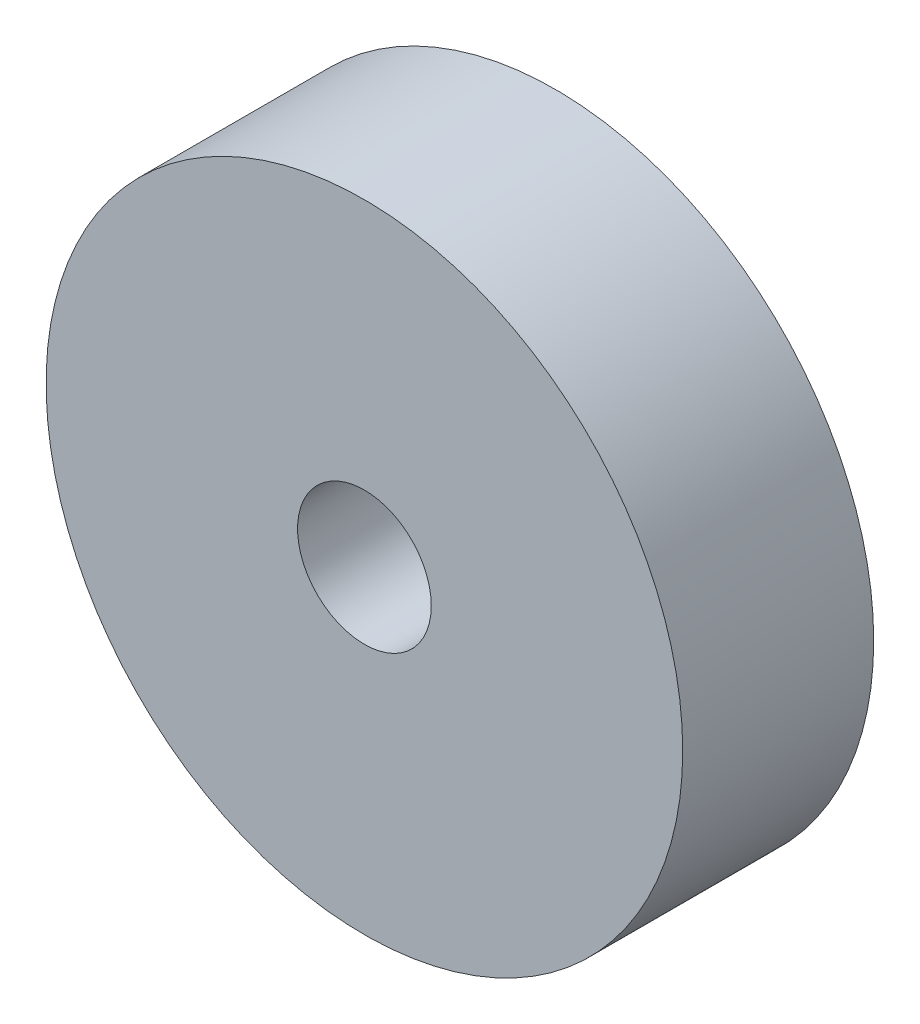
ISO-10303-21;
HEADER;
FILE_DESCRIPTION(('STEP AP214'),'2;1');
FILE_NAME('part.step','',(''),(''),'','','');
FILE_SCHEMA(('AUTOMOTIVE_DESIGN { 1 0 10303 214 1 1 1 1 }'));
ENDSEC;
DATA;
#1=APPLICATION_CONTEXT('core data for automotive mechanical design processes');
#2=APPLICATION_PROTOCOL_DEFINITION('international standard','automotive_design',2000,#1);
#3=PRODUCT_CONTEXT('',#1,'mechanical');
#4=PRODUCT('Part','Part','',(#3));
#5=PRODUCT_RELATED_PRODUCT_CATEGORY('part','',(#4));
#6=PRODUCT_DEFINITION_FORMATION('','',#4);
#7=PRODUCT_DEFINITION_CONTEXT('part definition',#1,'design');
#8=PRODUCT_DEFINITION('design','',#6,#7);
#9=PRODUCT_DEFINITION_SHAPE('','',#8);
#10=(LENGTH_UNIT() NAMED_UNIT(*) SI_UNIT(.MILLI.,.METRE.));
#11=(NAMED_UNIT(*) PLANE_ANGLE_UNIT() SI_UNIT($,.RADIAN.));
#12=(NAMED_UNIT(*) SI_UNIT($,.STERADIAN.) SOLID_ANGLE_UNIT());
#13=UNCERTAINTY_MEASURE_WITH_UNIT(LENGTH_MEASURE(1.E-05),#10,'distance_accuracy_value','');
#14=(GEOMETRIC_REPRESENTATION_CONTEXT(3) GLOBAL_UNCERTAINTY_ASSIGNED_CONTEXT((#13)) GLOBAL_UNIT_ASSIGNED_CONTEXT((#10,
#11,#12)) REPRESENTATION_CONTEXT('',''));
#15=CARTESIAN_POINT('',(0.,0.,0.));
#16=DIRECTION('',(0.,0.,1.));
#17=DIRECTION('',(1.,0.,0.));
#18=AXIS2_PLACEMENT_3D('',#15,#16,#17);
#19=CARTESIAN_POINT('',(0.,0.,6.));
#20=DIRECTION('',(0.,0.,1.));
#21=DIRECTION('',(1.,0.,0.));
#22=AXIS2_PLACEMENT_3D('',#19,#20,#21);
#23=PLANE('',#22);
#24=CARTESIAN_POINT('',(0.,0.,6.));
#25=DIRECTION('',(0.,0.,1.));
#26=DIRECTION('',(1.,0.,0.));
#27=AXIS2_PLACEMENT_3D('',#24,#25,#26);
#28=CIRCLE('',#27,10.);
#29=CARTESIAN_POINT('',(10.,0.,6.));
#30=VERTEX_POINT('',#29);
#31=EDGE_CURVE('E10',#30,#30,#28,.T.);
#32=ORIENTED_EDGE('',*,*,#31,.T.);
#33=EDGE_LOOP('',(#32));
#34=FACE_BOUND('',#33,.T.);
#35=CARTESIAN_POINT('',(0.,0.,6.));
#36=DIRECTION('',(0.,0.,1.));
#37=DIRECTION('',(1.,0.,0.));
#38=AXIS2_PLACEMENT_3D('',#35,#36,#37);
#39=CIRCLE('',#38,2.1);
#40=CARTESIAN_POINT('',(2.1,0.,6.));
#41=VERTEX_POINT('',#40);
#42=EDGE_CURVE('E50',#41,#41,#39,.T.);
#43=ORIENTED_EDGE('',*,*,#42,.F.);
#44=EDGE_LOOP('',(#43));
#45=FACE_BOUND('',#44,.T.);
#46=ADVANCED_FACE('F39',(#34,#45),#23,.T.);
#47=CARTESIAN_POINT('',(0.,0.,0.));
#48=DIRECTION('',(0.,0.,1.));
#49=DIRECTION('',(1.,0.,0.));
#50=AXIS2_PLACEMENT_3D('',#47,#48,#49);
#51=PLANE('',#50);
#52=CARTESIAN_POINT('',(0.,0.,0.));
#53=DIRECTION('',(0.,0.,1.));
#54=DIRECTION('',(1.,0.,0.));
#55=AXIS2_PLACEMENT_3D('',#52,#53,#54);
#56=CIRCLE('',#55,10.);
#57=CARTESIAN_POINT('',(10.,0.,0.));
#58=VERTEX_POINT('',#57);
#59=EDGE_CURVE('E43',#58,#58,#56,.T.);
#60=ORIENTED_EDGE('',*,*,#59,.F.);
#61=EDGE_LOOP('',(#60));
#62=FACE_BOUND('',#61,.T.);
#63=CARTESIAN_POINT('',(0.,0.,0.));
#64=DIRECTION('',(0.,0.,1.));
#65=DIRECTION('',(1.,0.,0.));
#66=AXIS2_PLACEMENT_3D('',#63,#64,#65);
#67=CIRCLE('',#66,2.1);
#68=CARTESIAN_POINT('',(2.1,0.,0.));
#69=VERTEX_POINT('',#68);
#70=EDGE_CURVE('E52',#69,#69,#67,.T.);
#71=ORIENTED_EDGE('',*,*,#70,.T.);
#72=EDGE_LOOP('',(#71));
#73=FACE_BOUND('',#72,.T.);
#74=ADVANCED_FACE('F62',(#62,#73),#51,.F.);
#75=CARTESIAN_POINT('',(0.,0.,6.));
#76=DIRECTION('',(0.,0.,-1.));
#77=DIRECTION('',(-1.,0.,0.));
#78=AXIS2_PLACEMENT_3D('',#75,#76,#77);
#79=CYLINDRICAL_SURFACE('',#78,10.);
#80=ORIENTED_EDGE('',*,*,#31,.F.);
#81=EDGE_LOOP('',(#80));
#82=FACE_BOUND('',#81,.T.);
#83=ORIENTED_EDGE('',*,*,#59,.T.);
#84=EDGE_LOOP('',(#83));
#85=FACE_BOUND('',#84,.T.);
#86=ADVANCED_FACE('F41',(#82,#85),#79,.T.);
#87=CARTESIAN_POINT('',(0.,0.,6.));
#88=DIRECTION('',(0.,0.,-1.));
#89=DIRECTION('',(-1.,0.,0.));
#90=AXIS2_PLACEMENT_3D('',#87,#88,#89);
#91=CYLINDRICAL_SURFACE('',#90,2.1);
#92=ORIENTED_EDGE('',*,*,#42,.T.);
#93=EDGE_LOOP('',(#92));
#94=FACE_BOUND('',#93,.T.);
#95=ORIENTED_EDGE('',*,*,#70,.F.);
#96=EDGE_LOOP('',(#95));
#97=FACE_BOUND('',#96,.T.);
#98=ADVANCED_FACE('F58',(#94,#97),#91,.F.);
#99=CLOSED_SHELL('',(#46,#74,#86,#98));
#100=MANIFOLD_SOLID_BREP('B2',#99);
#101=ADVANCED_BREP_SHAPE_REPRESENTATION('',(#18,#100),#14);
#102=SHAPE_DEFINITION_REPRESENTATION(#9,#101);
ENDSEC;
END-ISO-10303-21;
